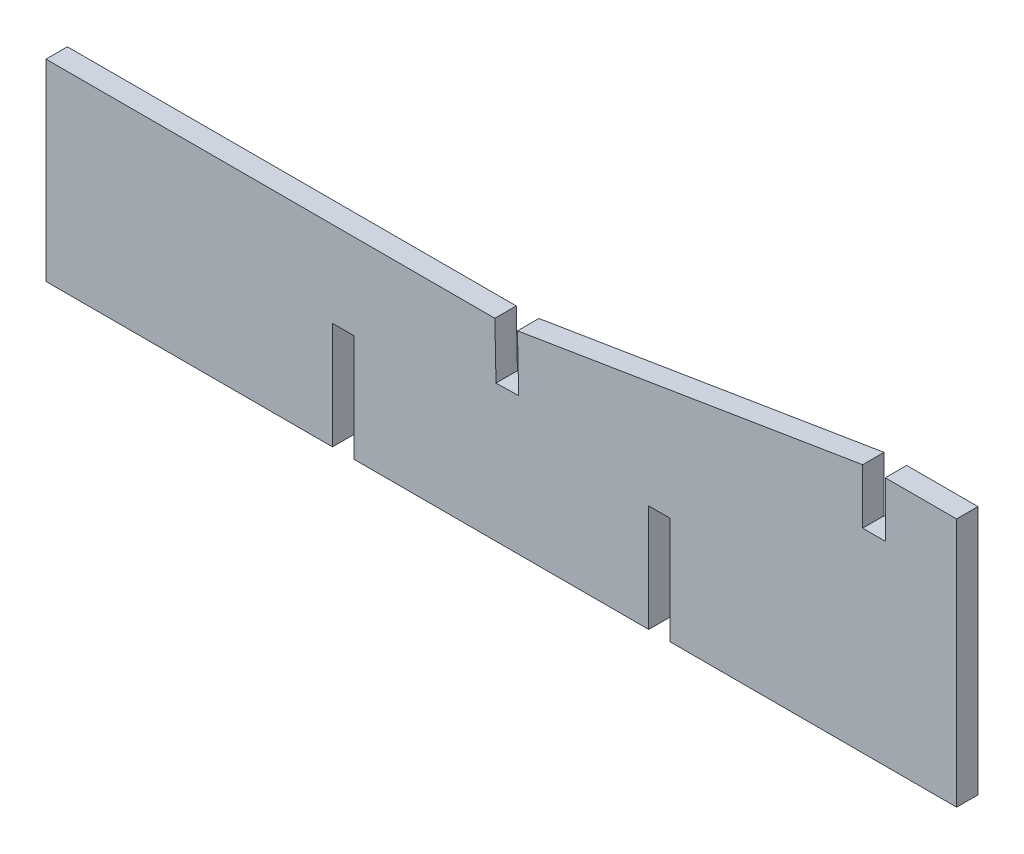
ISO-10303-21;
HEADER;
FILE_DESCRIPTION(('STEP AP214'),'2;1');
FILE_NAME('part.step','',(''),(''),'','','');
FILE_SCHEMA(('AUTOMOTIVE_DESIGN { 1 0 10303 214 1 1 1 1 }'));
ENDSEC;
DATA;
#1=APPLICATION_CONTEXT('core data for automotive mechanical design processes');
#2=APPLICATION_PROTOCOL_DEFINITION('international standard','automotive_design',2000,#1);
#3=PRODUCT_CONTEXT('',#1,'mechanical');
#4=PRODUCT('Part','Part','',(#3));
#5=PRODUCT_RELATED_PRODUCT_CATEGORY('part','',(#4));
#6=PRODUCT_DEFINITION_FORMATION('','',#4);
#7=PRODUCT_DEFINITION_CONTEXT('part definition',#1,'design');
#8=PRODUCT_DEFINITION('design','',#6,#7);
#9=PRODUCT_DEFINITION_SHAPE('','',#8);
#10=(LENGTH_UNIT() NAMED_UNIT(*) SI_UNIT(.MILLI.,.METRE.));
#11=(NAMED_UNIT(*) PLANE_ANGLE_UNIT() SI_UNIT($,.RADIAN.));
#12=(NAMED_UNIT(*) SI_UNIT($,.STERADIAN.) SOLID_ANGLE_UNIT());
#13=UNCERTAINTY_MEASURE_WITH_UNIT(LENGTH_MEASURE(1.E-05),#10,'distance_accuracy_value','');
#14=(GEOMETRIC_REPRESENTATION_CONTEXT(3) GLOBAL_UNCERTAINTY_ASSIGNED_CONTEXT((#13)) GLOBAL_UNIT_ASSIGNED_CONTEXT((#10,
#11,#12)) REPRESENTATION_CONTEXT('',''));
#15=CARTESIAN_POINT('',(0.,0.,0.));
#16=DIRECTION('',(0.,0.,1.));
#17=DIRECTION('',(1.,0.,0.));
#18=AXIS2_PLACEMENT_3D('',#15,#16,#17);
#19=CARTESIAN_POINT('',(374.396000000001,43.7427616706697,-570.));
#20=DIRECTION('',(1.,0.,0.));
#21=DIRECTION('',(0.,0.,-1.));
#22=AXIS2_PLACEMENT_3D('',#19,#20,#21);
#23=PLANE('',#22);
#24=DIRECTION('',(0.,-1.,0.));
#25=VECTOR('',#24,1.);
#26=CARTESIAN_POINT('',(374.396000000001,43.7427616706697,-573.));
#27=LINE('',#26,#25);
#28=CARTESIAN_POINT('',(374.396000000001,51.4509807604613,-573.));
#29=VERTEX_POINT('',#28);
#30=CARTESIAN_POINT('',(374.396000000001,43.7427616706697,-573.));
#31=VERTEX_POINT('',#30);
#32=EDGE_CURVE('E201',#29,#31,#27,.T.);
#33=ORIENTED_EDGE('',*,*,#32,.T.);
#34=DIRECTION('',(0.,0.,-1.));
#35=VECTOR('',#34,1.);
#36=CARTESIAN_POINT('',(374.396000000001,43.7427616706697,-570.));
#37=LINE('',#36,#35);
#38=CARTESIAN_POINT('',(374.396000000001,43.7427616706697,-570.));
#39=VERTEX_POINT('',#38);
#40=EDGE_CURVE('E11',#39,#31,#37,.T.);
#41=ORIENTED_EDGE('',*,*,#40,.F.);
#42=DIRECTION('',(0.,-1.,0.));
#43=VECTOR('',#42,1.);
#44=CARTESIAN_POINT('',(374.396000000001,43.7427616706697,-570.));
#45=LINE('',#44,#43);
#46=CARTESIAN_POINT('',(374.396000000001,51.4509807604613,-570.));
#47=VERTEX_POINT('',#46);
#48=EDGE_CURVE('E239',#47,#39,#45,.T.);
#49=ORIENTED_EDGE('',*,*,#48,.F.);
#50=DIRECTION('',(0.,0.,-1.));
#51=VECTOR('',#50,1.);
#52=CARTESIAN_POINT('',(374.396000000001,51.4509807604613,-570.));
#53=LINE('',#52,#51);
#54=EDGE_CURVE('E197',#47,#29,#53,.T.);
#55=ORIENTED_EDGE('',*,*,#54,.T.);
#56=EDGE_LOOP('',(#33,#41,#49,#55));
#57=FACE_BOUND('',#56,.T.);
#58=ADVANCED_FACE('F33',(#57),#23,.F.);
#59=CARTESIAN_POINT('',(371.221000000001,43.7427616706697,-570.));
#60=DIRECTION('',(0.,-1.,0.));
#61=DIRECTION('',(0.,0.,-1.));
#62=AXIS2_PLACEMENT_3D('',#59,#60,#61);
#63=PLANE('',#62);
#64=DIRECTION('',(-1.,0.,0.));
#65=VECTOR('',#64,1.);
#66=CARTESIAN_POINT('',(371.221000000001,43.7427616706697,-573.));
#67=LINE('',#66,#65);
#68=CARTESIAN_POINT('',(371.221000000001,43.7427616706697,-573.));
#69=VERTEX_POINT('',#68);
#70=EDGE_CURVE('E204',#31,#69,#67,.T.);
#71=ORIENTED_EDGE('',*,*,#70,.T.);
#72=DIRECTION('',(0.,0.,-1.));
#73=VECTOR('',#72,1.);
#74=CARTESIAN_POINT('',(371.221000000001,43.7427616706697,-570.));
#75=LINE('',#74,#73);
#76=CARTESIAN_POINT('',(371.221000000001,43.7427616706697,-570.));
#77=VERTEX_POINT('',#76);
#78=EDGE_CURVE('E41',#77,#69,#75,.T.);
#79=ORIENTED_EDGE('',*,*,#78,.F.);
#80=DIRECTION('',(-1.,0.,0.));
#81=VECTOR('',#80,1.);
#82=CARTESIAN_POINT('',(371.221000000001,43.7427616706697,-570.));
#83=LINE('',#82,#81);
#84=EDGE_CURVE('E128',#39,#77,#83,.T.);
#85=ORIENTED_EDGE('',*,*,#84,.F.);
#86=ORIENTED_EDGE('',*,*,#40,.T.);
#87=EDGE_LOOP('',(#71,#79,#85,#86));
#88=FACE_BOUND('',#87,.T.);
#89=ADVANCED_FACE('F357',(#88),#63,.F.);
#90=CARTESIAN_POINT('',(371.221000000001,43.7427616706697,-570.));
#91=DIRECTION('',(-1.,0.,0.));
#92=DIRECTION('',(0.,0.,1.));
#93=AXIS2_PLACEMENT_3D('',#90,#91,#92);
#94=PLANE('',#93);
#95=DIRECTION('',(0.,1.,0.));
#96=VECTOR('',#95,1.);
#97=CARTESIAN_POINT('',(371.221000000001,43.7427616706697,-573.));
#98=LINE('',#97,#96);
#99=CARTESIAN_POINT('',(371.221000000001,51.4509814046088,-573.));
#100=VERTEX_POINT('',#99);
#101=EDGE_CURVE('E206',#69,#100,#98,.T.);
#102=ORIENTED_EDGE('',*,*,#101,.T.);
#103=DIRECTION('',(0.,0.,-1.));
#104=VECTOR('',#103,1.);
#105=CARTESIAN_POINT('',(371.221000000001,51.4509814046088,-570.));
#106=LINE('',#105,#104);
#107=CARTESIAN_POINT('',(371.221000000001,51.4509814046088,-570.));
#108=VERTEX_POINT('',#107);
#109=EDGE_CURVE('E282',#108,#100,#106,.T.);
#110=ORIENTED_EDGE('',*,*,#109,.F.);
#111=DIRECTION('',(0.,1.,0.));
#112=VECTOR('',#111,1.);
#113=CARTESIAN_POINT('',(371.221000000001,43.7427616706697,-570.));
#114=LINE('',#113,#112);
#115=EDGE_CURVE('E290',#77,#108,#114,.T.);
#116=ORIENTED_EDGE('',*,*,#115,.F.);
#117=ORIENTED_EDGE('',*,*,#78,.T.);
#118=EDGE_LOOP('',(#102,#110,#116,#117));
#119=FACE_BOUND('',#118,.T.);
#120=ADVANCED_FACE('F288',(#119),#94,.F.);
#121=CARTESIAN_POINT('',(371.221000000001,51.4509814046088,-570.));
#122=DIRECTION('',(0.161916596900473,-0.986804446508106,0.));
#123=DIRECTION('',(0.986804446508106,0.161916596900473,0.));
#124=AXIS2_PLACEMENT_3D('',#121,#122,#123);
#125=PLANE('',#124);
#126=DIRECTION('',(-0.986804446508106,-0.161916596900473,0.));
#127=VECTOR('',#126,1.);
#128=CARTESIAN_POINT('',(371.221000000001,51.4509814046088,-573.));
#129=LINE('',#128,#127);
#130=CARTESIAN_POINT('',(322.817368060851,43.5088289457875,-573.));
#131=VERTEX_POINT('',#130);
#132=EDGE_CURVE('E208',#100,#131,#129,.T.);
#133=ORIENTED_EDGE('',*,*,#132,.T.);
#134=DIRECTION('',(0.,0.,-1.));
#135=VECTOR('',#134,1.);
#136=CARTESIAN_POINT('',(322.817368060851,43.5088289457875,-570.));
#137=LINE('',#136,#135);
#138=CARTESIAN_POINT('',(322.817368060851,43.5088289457875,-570.));
#139=VERTEX_POINT('',#138);
#140=EDGE_CURVE('E279',#139,#131,#137,.T.);
#141=ORIENTED_EDGE('',*,*,#140,.F.);
#142=DIRECTION('',(-0.986804446508106,-0.161916596900473,0.));
#143=VECTOR('',#142,1.);
#144=CARTESIAN_POINT('',(371.221000000001,51.4509814046088,-570.));
#145=LINE('',#144,#143);
#146=EDGE_CURVE('E308',#108,#139,#145,.T.);
#147=ORIENTED_EDGE('',*,*,#146,.F.);
#148=ORIENTED_EDGE('',*,*,#109,.T.);
#149=EDGE_LOOP('',(#133,#141,#147,#148));
#150=FACE_BOUND('',#149,.T.);
#151=ADVANCED_FACE('F299',(#150),#125,.F.);
#152=CARTESIAN_POINT('',(322.817368060851,43.5088289457875,-570.));
#153=DIRECTION('',(0.99978528148261,0.0207217501852044,0.));
#154=DIRECTION('',(-0.0207217501852044,0.99978528148261,0.));
#155=AXIS2_PLACEMENT_3D('',#152,#153,#154);
#156=PLANE('',#155);
#157=DIRECTION('',(0.0207217501852044,-0.99978528148261,0.));
#158=VECTOR('',#157,1.);
#159=CARTESIAN_POINT('',(322.817368060851,43.5088289457875,-573.));
#160=LINE('',#159,#158);
#161=CARTESIAN_POINT('',(322.978935297848,35.7135151293507,-573.));
#162=VERTEX_POINT('',#161);
#163=EDGE_CURVE('E210',#131,#162,#160,.T.);
#164=ORIENTED_EDGE('',*,*,#163,.T.);
#165=DIRECTION('',(0.,0.,-1.));
#166=VECTOR('',#165,1.);
#167=CARTESIAN_POINT('',(322.978935297848,35.7135151293507,-570.));
#168=LINE('',#167,#166);
#169=CARTESIAN_POINT('',(322.978935297848,35.7135151293507,-570.));
#170=VERTEX_POINT('',#169);
#171=EDGE_CURVE('E276',#170,#162,#168,.T.);
#172=ORIENTED_EDGE('',*,*,#171,.F.);
#173=DIRECTION('',(0.0207217501852044,-0.99978528148261,0.));
#174=VECTOR('',#173,1.);
#175=CARTESIAN_POINT('',(322.817368060851,43.5088289457875,-570.));
#176=LINE('',#175,#174);
#177=EDGE_CURVE('E305',#139,#170,#176,.T.);
#178=ORIENTED_EDGE('',*,*,#177,.F.);
#179=ORIENTED_EDGE('',*,*,#140,.T.);
#180=EDGE_LOOP('',(#164,#172,#178,#179));
#181=FACE_BOUND('',#180,.T.);
#182=ADVANCED_FACE('F303',(#181),#156,.F.);
#183=CARTESIAN_POINT('',(319.804603479745,35.6483115149985,-570.));
#184=DIRECTION('',(0.0205365622791845,-0.999789102566013,0.));
#185=DIRECTION('',(0.999789102566013,0.0205365622791845,0.));
#186=AXIS2_PLACEMENT_3D('',#183,#184,#185);
#187=PLANE('',#186);
#188=DIRECTION('',(-0.999789102566013,-0.0205365622791845,0.));
#189=VECTOR('',#188,1.);
#190=CARTESIAN_POINT('',(319.804603479745,35.6483115149985,-573.));
#191=LINE('',#190,#189);
#192=CARTESIAN_POINT('',(319.804603479745,35.6483115149985,-573.));
#193=VERTEX_POINT('',#192);
#194=EDGE_CURVE('E212',#162,#193,#191,.T.);
#195=ORIENTED_EDGE('',*,*,#194,.T.);
#196=DIRECTION('',(0.,0.,-1.));
#197=VECTOR('',#196,1.);
#198=CARTESIAN_POINT('',(319.804603479745,35.6483115149985,-570.));
#199=LINE('',#198,#197);
#200=CARTESIAN_POINT('',(319.804603479745,35.6483115149985,-570.));
#201=VERTEX_POINT('',#200);
#202=EDGE_CURVE('E273',#201,#193,#199,.T.);
#203=ORIENTED_EDGE('',*,*,#202,.F.);
#204=DIRECTION('',(-0.999789102566013,-0.0205365622791845,0.));
#205=VECTOR('',#204,1.);
#206=CARTESIAN_POINT('',(319.804603479745,35.6483115149985,-570.));
#207=LINE('',#206,#205);
#208=EDGE_CURVE('E307',#170,#201,#207,.T.);
#209=ORIENTED_EDGE('',*,*,#208,.F.);
#210=ORIENTED_EDGE('',*,*,#171,.T.);
#211=EDGE_LOOP('',(#195,#203,#209,#210));
#212=FACE_BOUND('',#211,.T.);
#213=ADVANCED_FACE('F370',(#212),#187,.F.);
#214=CARTESIAN_POINT('',(319.643036313534,43.4436219160998,-570.));
#215=DIRECTION('',(-0.999785281482607,-0.0207217501853462,0.));
#216=DIRECTION('',(0.0207217501853462,-0.999785281482607,0.));
#217=AXIS2_PLACEMENT_3D('',#214,#215,#216);
#218=PLANE('',#217);
#219=DIRECTION('',(-0.0207217501853462,0.999785281482607,0.));
#220=VECTOR('',#219,1.);
#221=CARTESIAN_POINT('',(319.643036313534,43.4436219160998,-573.));
#222=LINE('',#221,#220);
#223=CARTESIAN_POINT('',(319.643036313534,43.4436219160998,-573.));
#224=VERTEX_POINT('',#223);
#225=EDGE_CURVE('E214',#193,#224,#222,.T.);
#226=ORIENTED_EDGE('',*,*,#225,.T.);
#227=DIRECTION('',(0.,0.,-1.));
#228=VECTOR('',#227,1.);
#229=CARTESIAN_POINT('',(319.643036313534,43.4436219160998,-570.));
#230=LINE('',#229,#228);
#231=CARTESIAN_POINT('',(319.643036313534,43.4436219160998,-570.));
#232=VERTEX_POINT('',#231);
#233=EDGE_CURVE('E270',#232,#224,#230,.T.);
#234=ORIENTED_EDGE('',*,*,#233,.F.);
#235=DIRECTION('',(-0.0207217501853462,0.999785281482607,0.));
#236=VECTOR('',#235,1.);
#237=CARTESIAN_POINT('',(319.643036313534,43.4436219160998,-570.));
#238=LINE('',#237,#236);
#239=EDGE_CURVE('E310',#201,#232,#238,.T.);
#240=ORIENTED_EDGE('',*,*,#239,.F.);
#241=ORIENTED_EDGE('',*,*,#202,.T.);
#242=EDGE_LOOP('',(#226,#234,#240,#241));
#243=FACE_BOUND('',#242,.T.);
#244=ADVANCED_FACE('F373',(#243),#218,.F.);
#245=CARTESIAN_POINT('',(319.643036313534,43.4436219160998,-570.));
#246=DIRECTION('',(0.,-1.,0.));
#247=DIRECTION('',(1.,0.,0.));
#248=AXIS2_PLACEMENT_3D('',#245,#246,#247);
#249=PLANE('',#248);
#250=DIRECTION('',(-1.,0.,0.));
#251=VECTOR('',#250,1.);
#252=CARTESIAN_POINT('',(319.643036313534,43.4436219160998,-573.));
#253=LINE('',#252,#251);
#254=CARTESIAN_POINT('',(256.7,43.4436219160998,-573.));
#255=VERTEX_POINT('',#254);
#256=EDGE_CURVE('E216',#224,#255,#253,.T.);
#257=ORIENTED_EDGE('',*,*,#256,.T.);
#258=DIRECTION('',(0.,0.,-1.));
#259=VECTOR('',#258,1.);
#260=CARTESIAN_POINT('',(256.7,43.4436219160998,-570.));
#261=LINE('',#260,#259);
#262=CARTESIAN_POINT('',(256.7,43.4436219160998,-570.));
#263=VERTEX_POINT('',#262);
#264=EDGE_CURVE('E267',#263,#255,#261,.T.);
#265=ORIENTED_EDGE('',*,*,#264,.F.);
#266=DIRECTION('',(-1.,0.,0.));
#267=VECTOR('',#266,1.);
#268=CARTESIAN_POINT('',(319.643036313534,43.4436219160998,-570.));
#269=LINE('',#268,#267);
#270=EDGE_CURVE('E316',#232,#263,#269,.T.);
#271=ORIENTED_EDGE('',*,*,#270,.F.);
#272=ORIENTED_EDGE('',*,*,#233,.T.);
#273=EDGE_LOOP('',(#257,#265,#271,#272));
#274=FACE_BOUND('',#273,.T.);
#275=ADVANCED_FACE('F377',(#274),#249,.F.);
#276=CARTESIAN_POINT('',(256.7,43.4436219160998,-570.));
#277=DIRECTION('',(1.,0.,0.));
#278=DIRECTION('',(0.,0.,-1.));
#279=AXIS2_PLACEMENT_3D('',#276,#277,#278);
#280=PLANE('',#279);
#281=DIRECTION('',(0.,-1.,0.));
#282=VECTOR('',#281,1.);
#283=CARTESIAN_POINT('',(256.7,43.4436219160998,-573.));
#284=LINE('',#283,#282);
#285=CARTESIAN_POINT('',(256.7,16.4388254453726,-573.));
#286=VERTEX_POINT('',#285);
#287=EDGE_CURVE('E218',#255,#286,#284,.T.);
#288=ORIENTED_EDGE('',*,*,#287,.T.);
#289=DIRECTION('',(0.,0.,-1.));
#290=VECTOR('',#289,1.);
#291=CARTESIAN_POINT('',(256.7,16.4388254453726,-570.));
#292=LINE('',#291,#290);
#293=CARTESIAN_POINT('',(256.7,16.4388254453726,-570.));
#294=VERTEX_POINT('',#293);
#295=EDGE_CURVE('E264',#294,#286,#292,.T.);
#296=ORIENTED_EDGE('',*,*,#295,.F.);
#297=DIRECTION('',(0.,-1.,0.));
#298=VECTOR('',#297,1.);
#299=CARTESIAN_POINT('',(256.7,43.4436219160998,-570.));
#300=LINE('',#299,#298);
#301=EDGE_CURVE('E318',#263,#294,#300,.T.);
#302=ORIENTED_EDGE('',*,*,#301,.F.);
#303=ORIENTED_EDGE('',*,*,#264,.T.);
#304=EDGE_LOOP('',(#288,#296,#302,#303));
#305=FACE_BOUND('',#304,.T.);
#306=ADVANCED_FACE('F381',(#305),#280,.F.);
#307=CARTESIAN_POINT('',(256.7,16.4388254453726,-570.));
#308=DIRECTION('',(0.,1.,0.));
#309=DIRECTION('',(0.,0.,1.));
#310=AXIS2_PLACEMENT_3D('',#307,#308,#309);
#311=PLANE('',#310);
#312=DIRECTION('',(1.,0.,0.));
#313=VECTOR('',#312,1.);
#314=CARTESIAN_POINT('',(256.7,16.4388254453726,-573.));
#315=LINE('',#314,#313);
#316=CARTESIAN_POINT('',(296.875,16.4388254453726,-573.));
#317=VERTEX_POINT('',#316);
#318=EDGE_CURVE('E220',#286,#317,#315,.T.);
#319=ORIENTED_EDGE('',*,*,#318,.T.);
#320=DIRECTION('',(0.,0.,-1.));
#321=VECTOR('',#320,1.);
#322=CARTESIAN_POINT('',(296.875,16.4388254453726,-570.));
#323=LINE('',#322,#321);
#324=CARTESIAN_POINT('',(296.875,16.4388254453726,-570.));
#325=VERTEX_POINT('',#324);
#326=EDGE_CURVE('E261',#325,#317,#323,.T.);
#327=ORIENTED_EDGE('',*,*,#326,.F.);
#328=DIRECTION('',(1.,0.,0.));
#329=VECTOR('',#328,1.);
#330=CARTESIAN_POINT('',(256.7,16.4388254453726,-570.));
#331=LINE('',#330,#329);
#332=EDGE_CURVE('E320',#294,#325,#331,.T.);
#333=ORIENTED_EDGE('',*,*,#332,.F.);
#334=ORIENTED_EDGE('',*,*,#295,.T.);
#335=EDGE_LOOP('',(#319,#327,#333,#334));
#336=FACE_BOUND('',#335,.T.);
#337=ADVANCED_FACE('F385',(#336),#311,.F.);
#338=CARTESIAN_POINT('',(296.875,16.4388254453726,-570.));
#339=DIRECTION('',(-1.,0.,0.));
#340=DIRECTION('',(0.,0.,1.));
#341=AXIS2_PLACEMENT_3D('',#338,#339,#340);
#342=PLANE('',#341);
#343=DIRECTION('',(0.,1.,0.));
#344=VECTOR('',#343,1.);
#345=CARTESIAN_POINT('',(296.875,16.4388254453726,-573.));
#346=LINE('',#345,#344);
#347=CARTESIAN_POINT('',(296.875,31.4436219160998,-573.));
#348=VERTEX_POINT('',#347);
#349=EDGE_CURVE('E222',#317,#348,#346,.T.);
#350=ORIENTED_EDGE('',*,*,#349,.T.);
#351=DIRECTION('',(0.,0.,-1.));
#352=VECTOR('',#351,1.);
#353=CARTESIAN_POINT('',(296.875,31.4436219160998,-570.));
#354=LINE('',#353,#352);
#355=CARTESIAN_POINT('',(296.875,31.4436219160998,-570.));
#356=VERTEX_POINT('',#355);
#357=EDGE_CURVE('E258',#356,#348,#354,.T.);
#358=ORIENTED_EDGE('',*,*,#357,.F.);
#359=DIRECTION('',(0.,1.,0.));
#360=VECTOR('',#359,1.);
#361=CARTESIAN_POINT('',(296.875,16.4388254453726,-570.));
#362=LINE('',#361,#360);
#363=EDGE_CURVE('E322',#325,#356,#362,.T.);
#364=ORIENTED_EDGE('',*,*,#363,.F.);
#365=ORIENTED_EDGE('',*,*,#326,.T.);
#366=EDGE_LOOP('',(#350,#358,#364,#365));
#367=FACE_BOUND('',#366,.T.);
#368=ADVANCED_FACE('F389',(#367),#342,.F.);
#369=CARTESIAN_POINT('',(296.875,31.4436219160998,-570.));
#370=DIRECTION('',(0.,1.,0.));
#371=DIRECTION('',(0.,0.,1.));
#372=AXIS2_PLACEMENT_3D('',#369,#370,#371);
#373=PLANE('',#372);
#374=DIRECTION('',(1.,0.,0.));
#375=VECTOR('',#374,1.);
#376=CARTESIAN_POINT('',(296.875,31.4436219160998,-573.));
#377=LINE('',#376,#375);
#378=CARTESIAN_POINT('',(299.875,31.4436219160998,-573.));
#379=VERTEX_POINT('',#378);
#380=EDGE_CURVE('E224',#348,#379,#377,.T.);
#381=ORIENTED_EDGE('',*,*,#380,.T.);
#382=DIRECTION('',(0.,0.,-1.));
#383=VECTOR('',#382,1.);
#384=CARTESIAN_POINT('',(299.875,31.4436219160998,-570.));
#385=LINE('',#384,#383);
#386=CARTESIAN_POINT('',(299.875,31.4436219160998,-570.));
#387=VERTEX_POINT('',#386);
#388=EDGE_CURVE('E255',#387,#379,#385,.T.);
#389=ORIENTED_EDGE('',*,*,#388,.F.);
#390=DIRECTION('',(1.,0.,0.));
#391=VECTOR('',#390,1.);
#392=CARTESIAN_POINT('',(296.875,31.4436219160998,-570.));
#393=LINE('',#392,#391);
#394=EDGE_CURVE('E324',#356,#387,#393,.T.);
#395=ORIENTED_EDGE('',*,*,#394,.F.);
#396=ORIENTED_EDGE('',*,*,#357,.T.);
#397=EDGE_LOOP('',(#381,#389,#395,#396));
#398=FACE_BOUND('',#397,.T.);
#399=ADVANCED_FACE('F393',(#398),#373,.F.);
#400=CARTESIAN_POINT('',(299.875,31.4436219160998,-570.));
#401=DIRECTION('',(1.,0.,0.));
#402=DIRECTION('',(0.,0.,-1.));
#403=AXIS2_PLACEMENT_3D('',#400,#401,#402);
#404=PLANE('',#403);
#405=DIRECTION('',(0.,-1.,0.));
#406=VECTOR('',#405,1.);
#407=CARTESIAN_POINT('',(299.875,31.4436219160998,-573.));
#408=LINE('',#407,#406);
#409=CARTESIAN_POINT('',(299.875,16.4388254453726,-573.));
#410=VERTEX_POINT('',#409);
#411=EDGE_CURVE('E226',#379,#410,#408,.T.);
#412=ORIENTED_EDGE('',*,*,#411,.T.);
#413=DIRECTION('',(0.,0.,-1.));
#414=VECTOR('',#413,1.);
#415=CARTESIAN_POINT('',(299.875,16.4388254453726,-570.));
#416=LINE('',#415,#414);
#417=CARTESIAN_POINT('',(299.875,16.4388254453726,-570.));
#418=VERTEX_POINT('',#417);
#419=EDGE_CURVE('E252',#418,#410,#416,.T.);
#420=ORIENTED_EDGE('',*,*,#419,.F.);
#421=DIRECTION('',(0.,-1.,0.));
#422=VECTOR('',#421,1.);
#423=CARTESIAN_POINT('',(299.875,31.4436219160998,-570.));
#424=LINE('',#423,#422);
#425=EDGE_CURVE('E326',#387,#418,#424,.T.);
#426=ORIENTED_EDGE('',*,*,#425,.F.);
#427=ORIENTED_EDGE('',*,*,#388,.T.);
#428=EDGE_LOOP('',(#412,#420,#426,#427));
#429=FACE_BOUND('',#428,.T.);
#430=ADVANCED_FACE('F397',(#429),#404,.F.);
#431=CARTESIAN_POINT('',(299.875,16.4388254453726,-570.));
#432=DIRECTION('',(0.,1.,0.));
#433=DIRECTION('',(0.,0.,1.));
#434=AXIS2_PLACEMENT_3D('',#431,#432,#433);
#435=PLANE('',#434);
#436=DIRECTION('',(1.,0.,0.));
#437=VECTOR('',#436,1.);
#438=CARTESIAN_POINT('',(299.875,16.4388254453726,-573.));
#439=LINE('',#438,#437);
#440=CARTESIAN_POINT('',(341.221,16.4388254453726,-573.));
#441=VERTEX_POINT('',#440);
#442=EDGE_CURVE('E228',#410,#441,#439,.T.);
#443=ORIENTED_EDGE('',*,*,#442,.T.);
#444=DIRECTION('',(0.,0.,-1.));
#445=VECTOR('',#444,1.);
#446=CARTESIAN_POINT('',(341.221,16.4388254453726,-570.));
#447=LINE('',#446,#445);
#448=CARTESIAN_POINT('',(341.221,16.4388254453726,-570.));
#449=VERTEX_POINT('',#448);
#450=EDGE_CURVE('E249',#449,#441,#447,.T.);
#451=ORIENTED_EDGE('',*,*,#450,.F.);
#452=DIRECTION('',(1.,0.,0.));
#453=VECTOR('',#452,1.);
#454=CARTESIAN_POINT('',(299.875,16.4388254453726,-570.));
#455=LINE('',#454,#453);
#456=EDGE_CURVE('E328',#418,#449,#455,.T.);
#457=ORIENTED_EDGE('',*,*,#456,.F.);
#458=ORIENTED_EDGE('',*,*,#419,.T.);
#459=EDGE_LOOP('',(#443,#451,#457,#458));
#460=FACE_BOUND('',#459,.T.);
#461=ADVANCED_FACE('F401',(#460),#435,.F.);
#462=CARTESIAN_POINT('',(341.221,16.4388254453726,-570.));
#463=DIRECTION('',(-1.,0.,0.));
#464=DIRECTION('',(0.,-1.,0.));
#465=AXIS2_PLACEMENT_3D('',#462,#463,#464);
#466=PLANE('',#465);
#467=DIRECTION('',(0.,1.,0.));
#468=VECTOR('',#467,1.);
#469=CARTESIAN_POINT('',(341.221,16.4388254453726,-573.));
#470=LINE('',#469,#468);
#471=CARTESIAN_POINT('',(341.221000000001,31.4436219160998,-573.));
#472=VERTEX_POINT('',#471);
#473=EDGE_CURVE('E230',#441,#472,#470,.T.);
#474=ORIENTED_EDGE('',*,*,#473,.T.);
#475=DIRECTION('',(0.,0.,-1.));
#476=VECTOR('',#475,1.);
#477=CARTESIAN_POINT('',(341.221000000001,31.4436219160998,-570.));
#478=LINE('',#477,#476);
#479=CARTESIAN_POINT('',(341.221000000001,31.4436219160998,-570.));
#480=VERTEX_POINT('',#479);
#481=EDGE_CURVE('E246',#480,#472,#478,.T.);
#482=ORIENTED_EDGE('',*,*,#481,.F.);
#483=DIRECTION('',(0.,1.,0.));
#484=VECTOR('',#483,1.);
#485=CARTESIAN_POINT('',(341.221,16.4388254453726,-570.));
#486=LINE('',#485,#484);
#487=EDGE_CURVE('E330',#449,#480,#486,.T.);
#488=ORIENTED_EDGE('',*,*,#487,.F.);
#489=ORIENTED_EDGE('',*,*,#450,.T.);
#490=EDGE_LOOP('',(#474,#482,#488,#489));
#491=FACE_BOUND('',#490,.T.);
#492=ADVANCED_FACE('F405',(#491),#466,.F.);
#493=CARTESIAN_POINT('',(341.221000000001,31.4436219160998,-570.));
#494=DIRECTION('',(0.,1.,0.));
#495=DIRECTION('',(0.,0.,1.));
#496=AXIS2_PLACEMENT_3D('',#493,#494,#495);
#497=PLANE('',#496);
#498=DIRECTION('',(1.,0.,0.));
#499=VECTOR('',#498,1.);
#500=CARTESIAN_POINT('',(341.221000000001,31.4436219160998,-573.));
#501=LINE('',#500,#499);
#502=CARTESIAN_POINT('',(344.221000000001,31.4436219160998,-573.));
#503=VERTEX_POINT('',#502);
#504=EDGE_CURVE('E232',#472,#503,#501,.T.);
#505=ORIENTED_EDGE('',*,*,#504,.T.);
#506=DIRECTION('',(0.,0.,-1.));
#507=VECTOR('',#506,1.);
#508=CARTESIAN_POINT('',(344.221000000001,31.4436219160998,-570.));
#509=LINE('',#508,#507);
#510=CARTESIAN_POINT('',(344.221000000001,31.4436219160998,-570.));
#511=VERTEX_POINT('',#510);
#512=EDGE_CURVE('E243',#511,#503,#509,.T.);
#513=ORIENTED_EDGE('',*,*,#512,.F.);
#514=DIRECTION('',(1.,0.,0.));
#515=VECTOR('',#514,1.);
#516=CARTESIAN_POINT('',(341.221000000001,31.4436219160998,-570.));
#517=LINE('',#516,#515);
#518=EDGE_CURVE('E332',#480,#511,#517,.T.);
#519=ORIENTED_EDGE('',*,*,#518,.F.);
#520=ORIENTED_EDGE('',*,*,#481,.T.);
#521=EDGE_LOOP('',(#505,#513,#519,#520));
#522=FACE_BOUND('',#521,.T.);
#523=ADVANCED_FACE('F338',(#522),#497,.F.);
#524=CARTESIAN_POINT('',(344.221000000001,31.4436219160998,-570.));
#525=DIRECTION('',(1.,0.,0.));
#526=DIRECTION('',(0.,1.,0.));
#527=AXIS2_PLACEMENT_3D('',#524,#525,#526);
#528=PLANE('',#527);
#529=DIRECTION('',(0.,-1.,0.));
#530=VECTOR('',#529,1.);
#531=CARTESIAN_POINT('',(344.221000000001,31.4436219160998,-573.));
#532=LINE('',#531,#530);
#533=CARTESIAN_POINT('',(344.221,16.4388254453726,-573.));
#534=VERTEX_POINT('',#533);
#535=EDGE_CURVE('E234',#503,#534,#532,.T.);
#536=ORIENTED_EDGE('',*,*,#535,.T.);
#537=DIRECTION('',(0.,0.,-1.));
#538=VECTOR('',#537,1.);
#539=CARTESIAN_POINT('',(344.221,16.4388254453726,-570.));
#540=LINE('',#539,#538);
#541=CARTESIAN_POINT('',(344.221,16.4388254453726,-570.));
#542=VERTEX_POINT('',#541);
#543=EDGE_CURVE('E192',#542,#534,#540,.T.);
#544=ORIENTED_EDGE('',*,*,#543,.F.);
#545=DIRECTION('',(0.,-1.,0.));
#546=VECTOR('',#545,1.);
#547=CARTESIAN_POINT('',(344.221000000001,31.4436219160998,-570.));
#548=LINE('',#547,#546);
#549=EDGE_CURVE('E183',#511,#542,#548,.T.);
#550=ORIENTED_EDGE('',*,*,#549,.F.);
#551=ORIENTED_EDGE('',*,*,#512,.T.);
#552=EDGE_LOOP('',(#536,#544,#550,#551));
#553=FACE_BOUND('',#552,.T.);
#554=ADVANCED_FACE('F342',(#553),#528,.F.);
#555=CARTESIAN_POINT('',(344.221,16.4388254453726,-570.));
#556=DIRECTION('',(0.,1.,0.));
#557=DIRECTION('',(0.,0.,1.));
#558=AXIS2_PLACEMENT_3D('',#555,#556,#557);
#559=PLANE('',#558);
#560=DIRECTION('',(1.,0.,0.));
#561=VECTOR('',#560,1.);
#562=CARTESIAN_POINT('',(344.221,16.4388254453726,-573.));
#563=LINE('',#562,#561);
#564=CARTESIAN_POINT('',(384.396000000001,16.4388254453726,-573.));
#565=VERTEX_POINT('',#564);
#566=EDGE_CURVE('E191',#534,#565,#563,.T.);
#567=ORIENTED_EDGE('',*,*,#566,.T.);
#568=DIRECTION('',(0.,0.,-1.));
#569=VECTOR('',#568,1.);
#570=CARTESIAN_POINT('',(384.396000000001,16.4388254453726,-570.));
#571=LINE('',#570,#569);
#572=CARTESIAN_POINT('',(384.396000000001,16.4388254453726,-570.));
#573=VERTEX_POINT('',#572);
#574=EDGE_CURVE('E188',#573,#565,#571,.T.);
#575=ORIENTED_EDGE('',*,*,#574,.F.);
#576=DIRECTION('',(1.,0.,0.));
#577=VECTOR('',#576,1.);
#578=CARTESIAN_POINT('',(344.221,16.4388254453726,-570.));
#579=LINE('',#578,#577);
#580=EDGE_CURVE('E177',#542,#573,#579,.T.);
#581=ORIENTED_EDGE('',*,*,#580,.F.);
#582=ORIENTED_EDGE('',*,*,#543,.T.);
#583=EDGE_LOOP('',(#567,#575,#581,#582));
#584=FACE_BOUND('',#583,.T.);
#585=ADVANCED_FACE('F189',(#584),#559,.F.);
#586=CARTESIAN_POINT('',(384.396000000001,16.4388254453726,-570.));
#587=DIRECTION('',(-1.,0.,0.));
#588=DIRECTION('',(0.,0.,1.));
#589=AXIS2_PLACEMENT_3D('',#586,#587,#588);
#590=PLANE('',#589);
#591=DIRECTION('',(0.,1.,0.));
#592=VECTOR('',#591,1.);
#593=CARTESIAN_POINT('',(384.396000000001,16.4388254453726,-573.));
#594=LINE('',#593,#592);
#595=CARTESIAN_POINT('',(384.396000000001,51.4509807604613,-573.));
#596=VERTEX_POINT('',#595);
#597=EDGE_CURVE('E114',#565,#596,#594,.T.);
#598=ORIENTED_EDGE('',*,*,#597,.T.);
#599=DIRECTION('',(0.,0.,-1.));
#600=VECTOR('',#599,1.);
#601=CARTESIAN_POINT('',(384.396000000001,51.4509807604613,-570.));
#602=LINE('',#601,#600);
#603=CARTESIAN_POINT('',(384.396000000001,51.4509807604613,-570.));
#604=VERTEX_POINT('',#603);
#605=EDGE_CURVE('E193',#604,#596,#602,.T.);
#606=ORIENTED_EDGE('',*,*,#605,.F.);
#607=DIRECTION('',(0.,1.,0.));
#608=VECTOR('',#607,1.);
#609=CARTESIAN_POINT('',(384.396000000001,16.4388254453726,-570.));
#610=LINE('',#609,#608);
#611=EDGE_CURVE('E181',#573,#604,#610,.T.);
#612=ORIENTED_EDGE('',*,*,#611,.F.);
#613=ORIENTED_EDGE('',*,*,#574,.T.);
#614=EDGE_LOOP('',(#598,#606,#612,#613));
#615=FACE_BOUND('',#614,.T.);
#616=ADVANCED_FACE('F195',(#615),#590,.F.);
#617=CARTESIAN_POINT('',(384.396000000001,51.4509807604613,-570.));
#618=DIRECTION('',(0.,-1.,0.));
#619=DIRECTION('',(0.,0.,-1.));
#620=AXIS2_PLACEMENT_3D('',#617,#618,#619);
#621=PLANE('',#620);
#622=DIRECTION('',(-1.,0.,0.));
#623=VECTOR('',#622,1.);
#624=CARTESIAN_POINT('',(384.396000000001,51.4509807604613,-573.));
#625=LINE('',#624,#623);
#626=EDGE_CURVE('E120',#596,#29,#625,.T.);
#627=ORIENTED_EDGE('',*,*,#626,.T.);
#628=ORIENTED_EDGE('',*,*,#54,.F.);
#629=DIRECTION('',(-1.,0.,0.));
#630=VECTOR('',#629,1.);
#631=CARTESIAN_POINT('',(384.396000000001,51.4509807604613,-570.));
#632=LINE('',#631,#630);
#633=EDGE_CURVE('E49',#604,#47,#632,.T.);
#634=ORIENTED_EDGE('',*,*,#633,.F.);
#635=ORIENTED_EDGE('',*,*,#605,.T.);
#636=EDGE_LOOP('',(#627,#628,#634,#635));
#637=FACE_BOUND('',#636,.T.);
#638=ADVANCED_FACE('F346',(#637),#621,.F.);
#639=CARTESIAN_POINT('',(0.,0.,-570.));
#640=DIRECTION('',(0.,0.,1.));
#641=DIRECTION('',(1.,0.,0.));
#642=AXIS2_PLACEMENT_3D('',#639,#640,#641);
#643=PLANE('',#642);
#644=ORIENTED_EDGE('',*,*,#48,.T.);
#645=ORIENTED_EDGE('',*,*,#84,.T.);
#646=ORIENTED_EDGE('',*,*,#115,.T.);
#647=ORIENTED_EDGE('',*,*,#146,.T.);
#648=ORIENTED_EDGE('',*,*,#177,.T.);
#649=ORIENTED_EDGE('',*,*,#208,.T.);
#650=ORIENTED_EDGE('',*,*,#239,.T.);
#651=ORIENTED_EDGE('',*,*,#270,.T.);
#652=ORIENTED_EDGE('',*,*,#301,.T.);
#653=ORIENTED_EDGE('',*,*,#332,.T.);
#654=ORIENTED_EDGE('',*,*,#363,.T.);
#655=ORIENTED_EDGE('',*,*,#394,.T.);
#656=ORIENTED_EDGE('',*,*,#425,.T.);
#657=ORIENTED_EDGE('',*,*,#456,.T.);
#658=ORIENTED_EDGE('',*,*,#487,.T.);
#659=ORIENTED_EDGE('',*,*,#518,.T.);
#660=ORIENTED_EDGE('',*,*,#549,.T.);
#661=ORIENTED_EDGE('',*,*,#580,.T.);
#662=ORIENTED_EDGE('',*,*,#611,.T.);
#663=ORIENTED_EDGE('',*,*,#633,.T.);
#664=EDGE_LOOP('',(#644,#645,#646,#647,#648,#649,#650,#651,#652,#653,#654,#655,#656,#657,#658,
#659,#660,#661,#662,#663));
#665=FACE_BOUND('',#664,.T.);
#666=ADVANCED_FACE('F179',(#665),#643,.T.);
#667=CARTESIAN_POINT('',(0.,0.,-573.));
#668=DIRECTION('',(0.,0.,1.));
#669=DIRECTION('',(1.,0.,0.));
#670=AXIS2_PLACEMENT_3D('',#667,#668,#669);
#671=PLANE('',#670);
#672=ORIENTED_EDGE('',*,*,#32,.F.);
#673=ORIENTED_EDGE('',*,*,#626,.F.);
#674=ORIENTED_EDGE('',*,*,#597,.F.);
#675=ORIENTED_EDGE('',*,*,#566,.F.);
#676=ORIENTED_EDGE('',*,*,#535,.F.);
#677=ORIENTED_EDGE('',*,*,#504,.F.);
#678=ORIENTED_EDGE('',*,*,#473,.F.);
#679=ORIENTED_EDGE('',*,*,#442,.F.);
#680=ORIENTED_EDGE('',*,*,#411,.F.);
#681=ORIENTED_EDGE('',*,*,#380,.F.);
#682=ORIENTED_EDGE('',*,*,#349,.F.);
#683=ORIENTED_EDGE('',*,*,#318,.F.);
#684=ORIENTED_EDGE('',*,*,#287,.F.);
#685=ORIENTED_EDGE('',*,*,#256,.F.);
#686=ORIENTED_EDGE('',*,*,#225,.F.);
#687=ORIENTED_EDGE('',*,*,#194,.F.);
#688=ORIENTED_EDGE('',*,*,#163,.F.);
#689=ORIENTED_EDGE('',*,*,#132,.F.);
#690=ORIENTED_EDGE('',*,*,#101,.F.);
#691=ORIENTED_EDGE('',*,*,#70,.F.);
#692=EDGE_LOOP('',(#672,#673,#674,#675,#676,#677,#678,#679,#680,#681,#682,#683,#684,#685,#686,
#687,#688,#689,#690,#691));
#693=FACE_BOUND('',#692,.T.);
#694=ADVANCED_FACE('F294',(#693),#671,.F.);
#695=CLOSED_SHELL('',(#58,#89,#120,#151,#182,#213,#244,#275,#306,#337,#368,#399,#430,#461,#492,
#523,#554,#585,#616,#638,#666,#694));
#696=MANIFOLD_SOLID_BREP('B2',#695);
#697=ADVANCED_BREP_SHAPE_REPRESENTATION('',(#18,#696),#14);
#698=SHAPE_DEFINITION_REPRESENTATION(#9,#697);
ENDSEC;
END-ISO-10303-21;
